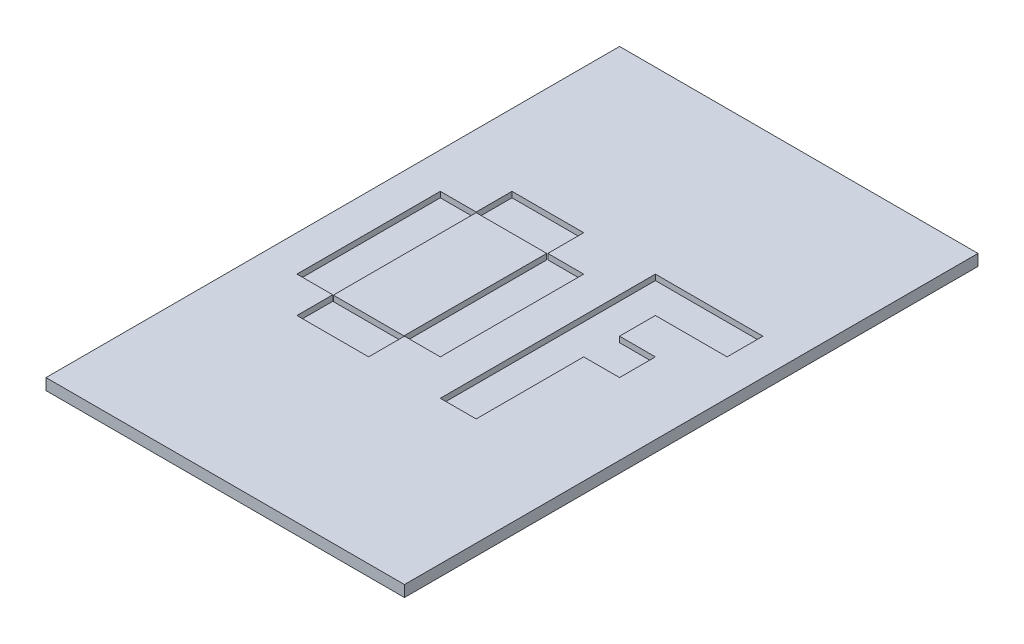
ISO-10303-21;
HEADER;
FILE_DESCRIPTION(('STEP AP214'),'2;1');
FILE_NAME('part.step','',(''),(''),'','','');
FILE_SCHEMA(('AUTOMOTIVE_DESIGN { 1 0 10303 214 1 1 1 1 }'));
ENDSEC;
DATA;
#1=APPLICATION_CONTEXT('core data for automotive mechanical design processes');
#2=APPLICATION_PROTOCOL_DEFINITION('international standard','automotive_design',2000,#1);
#3=PRODUCT_CONTEXT('',#1,'mechanical');
#4=PRODUCT('Part','Part','',(#3));
#5=PRODUCT_RELATED_PRODUCT_CATEGORY('part','',(#4));
#6=PRODUCT_DEFINITION_FORMATION('','',#4);
#7=PRODUCT_DEFINITION_CONTEXT('part definition',#1,'design');
#8=PRODUCT_DEFINITION('design','',#6,#7);
#9=PRODUCT_DEFINITION_SHAPE('','',#8);
#10=(LENGTH_UNIT() NAMED_UNIT(*) SI_UNIT(.MILLI.,.METRE.));
#11=(NAMED_UNIT(*) PLANE_ANGLE_UNIT() SI_UNIT($,.RADIAN.));
#12=(NAMED_UNIT(*) SI_UNIT($,.STERADIAN.) SOLID_ANGLE_UNIT());
#13=UNCERTAINTY_MEASURE_WITH_UNIT(LENGTH_MEASURE(1.E-05),#10,'distance_accuracy_value','');
#14=(GEOMETRIC_REPRESENTATION_CONTEXT(3) GLOBAL_UNCERTAINTY_ASSIGNED_CONTEXT((#13)) GLOBAL_UNIT_ASSIGNED_CONTEXT((#10,
#11,#12)) REPRESENTATION_CONTEXT('',''));
#15=CARTESIAN_POINT('',(0.,0.,0.));
#16=DIRECTION('',(0.,0.,1.));
#17=DIRECTION('',(1.,0.,0.));
#18=AXIS2_PLACEMENT_3D('',#15,#16,#17);
#19=CARTESIAN_POINT('',(25.6,4.,-126.8));
#20=DIRECTION('',(1.,0.,0.));
#21=DIRECTION('',(0.,0.,-1.));
#22=AXIS2_PLACEMENT_3D('',#19,#20,#21);
#23=PLANE('',#22);
#24=DIRECTION('',(0.,0.,1.));
#25=VECTOR('',#24,1.);
#26=CARTESIAN_POINT('',(25.6,2.,-126.8));
#27=LINE('',#26,#25);
#28=CARTESIAN_POINT('',(25.6,2.,-126.8));
#29=VERTEX_POINT('',#28);
#30=CARTESIAN_POINT('',(25.6,2.,-76.2));
#31=VERTEX_POINT('',#30);
#32=EDGE_CURVE('E112',#29,#31,#27,.T.);
#33=ORIENTED_EDGE('',*,*,#32,.T.);
#34=DIRECTION('',(0.,-1.,0.));
#35=VECTOR('',#34,1.);
#36=CARTESIAN_POINT('',(25.6,4.,-76.2));
#37=LINE('',#36,#35);
#38=CARTESIAN_POINT('',(25.6,4.,-76.2));
#39=VERTEX_POINT('',#38);
#40=EDGE_CURVE('E12',#39,#31,#37,.T.);
#41=ORIENTED_EDGE('',*,*,#40,.F.);
#42=DIRECTION('',(0.,0.,1.));
#43=VECTOR('',#42,1.);
#44=CARTESIAN_POINT('',(25.6,4.,-126.8));
#45=LINE('',#44,#43);
#46=CARTESIAN_POINT('',(25.6,4.,-126.8));
#47=VERTEX_POINT('',#46);
#48=EDGE_CURVE('E100',#47,#39,#45,.T.);
#49=ORIENTED_EDGE('',*,*,#48,.F.);
#50=DIRECTION('',(0.,-1.,0.));
#51=VECTOR('',#50,1.);
#52=CARTESIAN_POINT('',(25.6,4.,-126.8));
#53=LINE('',#52,#51);
#54=EDGE_CURVE('E108',#47,#29,#53,.T.);
#55=ORIENTED_EDGE('',*,*,#54,.T.);
#56=EDGE_LOOP('',(#33,#41,#49,#55));
#57=FACE_BOUND('',#56,.T.);
#58=ADVANCED_FACE('F49',(#57),#23,.F.);
#59=CARTESIAN_POINT('',(25.6,4.,-76.2));
#60=DIRECTION('',(0.,0.,-1.));
#61=DIRECTION('',(-1.,0.,0.));
#62=AXIS2_PLACEMENT_3D('',#59,#60,#61);
#63=PLANE('',#62);
#64=DIRECTION('',(1.,0.,0.));
#65=VECTOR('',#64,1.);
#66=CARTESIAN_POINT('',(25.6,2.,-76.2));
#67=LINE('',#66,#65);
#68=CARTESIAN_POINT('',(50.6,2.,-76.2));
#69=VERTEX_POINT('',#68);
#70=EDGE_CURVE('E104',#31,#69,#67,.T.);
#71=ORIENTED_EDGE('',*,*,#70,.T.);
#72=DIRECTION('',(0.,-1.,0.));
#73=VECTOR('',#72,1.);
#74=CARTESIAN_POINT('',(50.6,4.,-76.2));
#75=LINE('',#74,#73);
#76=CARTESIAN_POINT('',(50.6,4.,-76.2));
#77=VERTEX_POINT('',#76);
#78=EDGE_CURVE('E57',#77,#69,#75,.T.);
#79=ORIENTED_EDGE('',*,*,#78,.F.);
#80=DIRECTION('',(1.,0.,0.));
#81=VECTOR('',#80,1.);
#82=CARTESIAN_POINT('',(25.6,4.,-76.2));
#83=LINE('',#82,#81);
#84=EDGE_CURVE('E95',#39,#77,#83,.T.);
#85=ORIENTED_EDGE('',*,*,#84,.F.);
#86=ORIENTED_EDGE('',*,*,#40,.T.);
#87=EDGE_LOOP('',(#71,#79,#85,#86));
#88=FACE_BOUND('',#87,.T.);
#89=ADVANCED_FACE('F103',(#88),#63,.F.);
#90=CARTESIAN_POINT('',(50.6,4.,-126.8));
#91=DIRECTION('',(-1.,0.,0.));
#92=DIRECTION('',(0.,0.,1.));
#93=AXIS2_PLACEMENT_3D('',#90,#91,#92);
#94=PLANE('',#93);
#95=DIRECTION('',(0.,0.,-1.));
#96=VECTOR('',#95,1.);
#97=CARTESIAN_POINT('',(50.6,2.,-126.8));
#98=LINE('',#97,#96);
#99=CARTESIAN_POINT('',(50.6,2.,-126.8));
#100=VERTEX_POINT('',#99);
#101=EDGE_CURVE('E82',#69,#100,#98,.T.);
#102=ORIENTED_EDGE('',*,*,#101,.T.);
#103=DIRECTION('',(0.,-1.,0.));
#104=VECTOR('',#103,1.);
#105=CARTESIAN_POINT('',(50.6,4.,-126.8));
#106=LINE('',#105,#104);
#107=CARTESIAN_POINT('',(50.6,4.,-126.8));
#108=VERTEX_POINT('',#107);
#109=EDGE_CURVE('E105',#108,#100,#106,.T.);
#110=ORIENTED_EDGE('',*,*,#109,.F.);
#111=DIRECTION('',(0.,0.,-1.));
#112=VECTOR('',#111,1.);
#113=CARTESIAN_POINT('',(50.6,4.,-126.8));
#114=LINE('',#113,#112);
#115=EDGE_CURVE('E98',#77,#108,#114,.T.);
#116=ORIENTED_EDGE('',*,*,#115,.F.);
#117=ORIENTED_EDGE('',*,*,#78,.T.);
#118=EDGE_LOOP('',(#102,#110,#116,#117));
#119=FACE_BOUND('',#118,.T.);
#120=ADVANCED_FACE('F106',(#119),#94,.F.);
#121=CARTESIAN_POINT('',(25.6,4.,-126.8));
#122=DIRECTION('',(0.,0.,1.));
#123=DIRECTION('',(1.,0.,0.));
#124=AXIS2_PLACEMENT_3D('',#121,#122,#123);
#125=PLANE('',#124);
#126=DIRECTION('',(-1.,0.,0.));
#127=VECTOR('',#126,1.);
#128=CARTESIAN_POINT('',(25.6,2.,-126.8));
#129=LINE('',#128,#127);
#130=EDGE_CURVE('E88',#100,#29,#129,.T.);
#131=ORIENTED_EDGE('',*,*,#130,.T.);
#132=ORIENTED_EDGE('',*,*,#54,.F.);
#133=DIRECTION('',(-1.,0.,0.));
#134=VECTOR('',#133,1.);
#135=CARTESIAN_POINT('',(25.6,4.,-126.8));
#136=LINE('',#135,#134);
#137=EDGE_CURVE('E65',#108,#47,#136,.T.);
#138=ORIENTED_EDGE('',*,*,#137,.F.);
#139=ORIENTED_EDGE('',*,*,#109,.T.);
#140=EDGE_LOOP('',(#131,#132,#138,#139));
#141=FACE_BOUND('',#140,.T.);
#142=ADVANCED_FACE('F119',(#141),#125,.F.);
#143=CARTESIAN_POINT('',(0.,4.,0.));
#144=DIRECTION('',(0.,1.,0.));
#145=DIRECTION('',(0.,0.,1.));
#146=AXIS2_PLACEMENT_3D('',#143,#144,#145);
#147=PLANE('',#146);
#148=ORIENTED_EDGE('',*,*,#48,.T.);
#149=ORIENTED_EDGE('',*,*,#84,.T.);
#150=ORIENTED_EDGE('',*,*,#115,.T.);
#151=ORIENTED_EDGE('',*,*,#137,.T.);
#152=EDGE_LOOP('',(#148,#149,#150,#151));
#153=FACE_BOUND('',#152,.T.);
#154=ADVANCED_FACE('F96',(#153),#147,.T.);
#155=CARTESIAN_POINT('',(0.,2.,0.));
#156=DIRECTION('',(0.,1.,0.));
#157=DIRECTION('',(0.,0.,1.));
#158=AXIS2_PLACEMENT_3D('',#155,#156,#157);
#159=PLANE('',#158);
#160=ORIENTED_EDGE('',*,*,#32,.F.);
#161=ORIENTED_EDGE('',*,*,#130,.F.);
#162=ORIENTED_EDGE('',*,*,#101,.F.);
#163=ORIENTED_EDGE('',*,*,#70,.F.);
#164=EDGE_LOOP('',(#160,#161,#162,#163));
#165=FACE_BOUND('',#164,.T.);
#166=ADVANCED_FACE('F122',(#165),#159,.F.);
#167=CLOSED_SHELL('',(#58,#89,#120,#142,#154,#166));
#168=MANIFOLD_SOLID_BREP('B2',#167);
#169=CARTESIAN_POINT('',(0.,4.,0.));
#170=DIRECTION('',(-1.,0.,0.));
#171=DIRECTION('',(0.,0.,1.));
#172=AXIS2_PLACEMENT_3D('',#169,#170,#171);
#173=PLANE('',#172);
#174=DIRECTION('',(0.,0.,-1.));
#175=VECTOR('',#174,1.);
#176=CARTESIAN_POINT('',(0.,0.,0.));
#177=LINE('',#176,#175);
#178=CARTESIAN_POINT('',(0.,0.,0.));
#179=VERTEX_POINT('',#178);
#180=CARTESIAN_POINT('',(0.,0.,-203.2));
#181=VERTEX_POINT('',#180);
#182=EDGE_CURVE('E511',#179,#181,#177,.T.);
#183=ORIENTED_EDGE('',*,*,#182,.F.);
#184=DIRECTION('',(0.,-1.,0.));
#185=VECTOR('',#184,1.);
#186=CARTESIAN_POINT('',(0.,4.,0.));
#187=LINE('',#186,#185);
#188=CARTESIAN_POINT('',(0.,4.,0.));
#189=VERTEX_POINT('',#188);
#190=EDGE_CURVE('E47',#189,#179,#187,.T.);
#191=ORIENTED_EDGE('',*,*,#190,.F.);
#192=DIRECTION('',(0.,0.,-1.));
#193=VECTOR('',#192,1.);
#194=CARTESIAN_POINT('',(0.,4.,0.));
#195=LINE('',#194,#193);
#196=CARTESIAN_POINT('',(0.,4.,-203.2));
#197=VERTEX_POINT('',#196);
#198=EDGE_CURVE('E529',#189,#197,#195,.T.);
#199=ORIENTED_EDGE('',*,*,#198,.T.);
#200=DIRECTION('',(0.,-1.,0.));
#201=VECTOR('',#200,1.);
#202=CARTESIAN_POINT('',(0.,4.,-203.2));
#203=LINE('',#202,#201);
#204=EDGE_CURVE('E188',#197,#181,#203,.T.);
#205=ORIENTED_EDGE('',*,*,#204,.T.);
#206=EDGE_LOOP('',(#183,#191,#199,#205));
#207=FACE_BOUND('',#206,.T.);
#208=ADVANCED_FACE('F185',(#207),#173,.T.);
#209=CARTESIAN_POINT('',(0.,4.,0.));
#210=DIRECTION('',(0.,0.,-1.));
#211=DIRECTION('',(-1.,0.,0.));
#212=AXIS2_PLACEMENT_3D('',#209,#210,#211);
#213=PLANE('',#212);
#214=DIRECTION('',(1.,0.,0.));
#215=VECTOR('',#214,1.);
#216=CARTESIAN_POINT('',(0.,0.,0.));
#217=LINE('',#216,#215);
#218=CARTESIAN_POINT('',(127.,0.,0.));
#219=VERTEX_POINT('',#218);
#220=EDGE_CURVE('E533',#179,#219,#217,.T.);
#221=ORIENTED_EDGE('',*,*,#220,.T.);
#222=DIRECTION('',(0.,-1.,0.));
#223=VECTOR('',#222,1.);
#224=CARTESIAN_POINT('',(127.,4.,0.));
#225=LINE('',#224,#223);
#226=CARTESIAN_POINT('',(127.,4.,0.));
#227=VERTEX_POINT('',#226);
#228=EDGE_CURVE('E193',#227,#219,#225,.T.);
#229=ORIENTED_EDGE('',*,*,#228,.F.);
#230=DIRECTION('',(1.,0.,0.));
#231=VECTOR('',#230,1.);
#232=CARTESIAN_POINT('',(0.,4.,0.));
#233=LINE('',#232,#231);
#234=EDGE_CURVE('E538',#189,#227,#233,.T.);
#235=ORIENTED_EDGE('',*,*,#234,.F.);
#236=ORIENTED_EDGE('',*,*,#190,.T.);
#237=EDGE_LOOP('',(#221,#229,#235,#236));
#238=FACE_BOUND('',#237,.T.);
#239=ADVANCED_FACE('F565',(#238),#213,.F.);
#240=CARTESIAN_POINT('',(127.,4.,0.));
#241=DIRECTION('',(-1.,0.,0.));
#242=DIRECTION('',(0.,0.,1.));
#243=AXIS2_PLACEMENT_3D('',#240,#241,#242);
#244=PLANE('',#243);
#245=DIRECTION('',(0.,0.,-1.));
#246=VECTOR('',#245,1.);
#247=CARTESIAN_POINT('',(127.,0.,0.));
#248=LINE('',#247,#246);
#249=CARTESIAN_POINT('',(127.,0.,-203.2));
#250=VERTEX_POINT('',#249);
#251=EDGE_CURVE('E545',#219,#250,#248,.T.);
#252=ORIENTED_EDGE('',*,*,#251,.T.);
#253=DIRECTION('',(0.,-1.,0.));
#254=VECTOR('',#253,1.);
#255=CARTESIAN_POINT('',(127.,4.,-203.2));
#256=LINE('',#255,#254);
#257=CARTESIAN_POINT('',(127.,4.,-203.2));
#258=VERTEX_POINT('',#257);
#259=EDGE_CURVE('E550',#258,#250,#256,.T.);
#260=ORIENTED_EDGE('',*,*,#259,.F.);
#261=DIRECTION('',(0.,0.,-1.));
#262=VECTOR('',#261,1.);
#263=CARTESIAN_POINT('',(127.,4.,0.));
#264=LINE('',#263,#262);
#265=EDGE_CURVE('E536',#227,#258,#264,.T.);
#266=ORIENTED_EDGE('',*,*,#265,.F.);
#267=ORIENTED_EDGE('',*,*,#228,.T.);
#268=EDGE_LOOP('',(#252,#260,#266,#267));
#269=FACE_BOUND('',#268,.T.);
#270=ADVANCED_FACE('F569',(#269),#244,.F.);
#271=CARTESIAN_POINT('',(0.,4.,-203.2));
#272=DIRECTION('',(0.,0.,-1.));
#273=DIRECTION('',(-1.,0.,0.));
#274=AXIS2_PLACEMENT_3D('',#271,#272,#273);
#275=PLANE('',#274);
#276=DIRECTION('',(1.,0.,0.));
#277=VECTOR('',#276,1.);
#278=CARTESIAN_POINT('',(0.,0.,-203.2));
#279=LINE('',#278,#277);
#280=EDGE_CURVE('E542',#181,#250,#279,.T.);
#281=ORIENTED_EDGE('',*,*,#280,.F.);
#282=ORIENTED_EDGE('',*,*,#204,.F.);
#283=DIRECTION('',(1.,0.,0.));
#284=VECTOR('',#283,1.);
#285=CARTESIAN_POINT('',(0.,4.,-203.2));
#286=LINE('',#285,#284);
#287=EDGE_CURVE('E532',#197,#258,#286,.T.);
#288=ORIENTED_EDGE('',*,*,#287,.T.);
#289=ORIENTED_EDGE('',*,*,#259,.T.);
#290=EDGE_LOOP('',(#281,#282,#288,#289));
#291=FACE_BOUND('',#290,.T.);
#292=ADVANCED_FACE('F558',(#291),#275,.T.);
#293=CARTESIAN_POINT('',(0.,4.,0.));
#294=DIRECTION('',(0.,-1.,0.));
#295=DIRECTION('',(0.,0.,-1.));
#296=AXIS2_PLACEMENT_3D('',#293,#294,#295);
#297=PLANE('',#296);
#298=DIRECTION('',(0.,0.,1.));
#299=VECTOR('',#298,1.);
#300=CARTESIAN_POINT('',(25.4,4.,0.));
#301=LINE('',#300,#299);
#302=CARTESIAN_POINT('',(25.4,4.,-76.2));
#303=VERTEX_POINT('',#302);
#304=CARTESIAN_POINT('',(25.4,4.,-63.5));
#305=VERTEX_POINT('',#304);
#306=EDGE_CURVE('E407',#303,#305,#301,.T.);
#307=ORIENTED_EDGE('',*,*,#306,.F.);
#308=DIRECTION('',(1.,0.,0.));
#309=VECTOR('',#308,1.);
#310=CARTESIAN_POINT('',(0.,4.,-76.2));
#311=LINE('',#310,#309);
#312=CARTESIAN_POINT('',(12.7,4.,-76.2));
#313=VERTEX_POINT('',#312);
#314=EDGE_CURVE('E201',#313,#303,#311,.T.);
#315=ORIENTED_EDGE('',*,*,#314,.F.);
#316=DIRECTION('',(0.,0.,1.));
#317=VECTOR('',#316,1.);
#318=CARTESIAN_POINT('',(12.7,4.,0.));
#319=LINE('',#318,#317);
#320=CARTESIAN_POINT('',(12.7,4.,-127.));
#321=VERTEX_POINT('',#320);
#322=EDGE_CURVE('E380',#321,#313,#319,.T.);
#323=ORIENTED_EDGE('',*,*,#322,.F.);
#324=DIRECTION('',(1.,0.,0.));
#325=VECTOR('',#324,1.);
#326=CARTESIAN_POINT('',(0.,4.,-127.));
#327=LINE('',#326,#325);
#328=CARTESIAN_POINT('',(25.4,4.,-127.));
#329=VERTEX_POINT('',#328);
#330=EDGE_CURVE('E383',#321,#329,#327,.T.);
#331=ORIENTED_EDGE('',*,*,#330,.T.);
#332=DIRECTION('',(0.,0.,-1.));
#333=VECTOR('',#332,1.);
#334=CARTESIAN_POINT('',(25.4,4.,0.));
#335=LINE('',#334,#333);
#336=CARTESIAN_POINT('',(25.4,4.,-139.7));
#337=VERTEX_POINT('',#336);
#338=EDGE_CURVE('E430',#329,#337,#335,.T.);
#339=ORIENTED_EDGE('',*,*,#338,.T.);
#340=DIRECTION('',(1.,0.,0.));
#341=VECTOR('',#340,1.);
#342=CARTESIAN_POINT('',(0.,4.,-139.7));
#343=LINE('',#342,#341);
#344=CARTESIAN_POINT('',(50.8,4.,-139.7));
#345=VERTEX_POINT('',#344);
#346=EDGE_CURVE('E427',#337,#345,#343,.T.);
#347=ORIENTED_EDGE('',*,*,#346,.T.);
#348=DIRECTION('',(0.,0.,-1.));
#349=VECTOR('',#348,1.);
#350=CARTESIAN_POINT('',(50.8,4.,0.));
#351=LINE('',#350,#349);
#352=CARTESIAN_POINT('',(50.8,4.,-127.));
#353=VERTEX_POINT('',#352);
#354=EDGE_CURVE('E424',#353,#345,#351,.T.);
#355=ORIENTED_EDGE('',*,*,#354,.F.);
#356=DIRECTION('',(1.,0.,0.));
#357=VECTOR('',#356,1.);
#358=CARTESIAN_POINT('',(0.,4.,-127.));
#359=LINE('',#358,#357);
#360=CARTESIAN_POINT('',(63.5,4.,-127.));
#361=VERTEX_POINT('',#360);
#362=EDGE_CURVE('E421',#353,#361,#359,.T.);
#363=ORIENTED_EDGE('',*,*,#362,.T.);
#364=DIRECTION('',(0.,0.,1.));
#365=VECTOR('',#364,1.);
#366=CARTESIAN_POINT('',(63.5,4.,0.));
#367=LINE('',#366,#365);
#368=CARTESIAN_POINT('',(63.5,4.,-76.2));
#369=VERTEX_POINT('',#368);
#370=EDGE_CURVE('E418',#361,#369,#367,.T.);
#371=ORIENTED_EDGE('',*,*,#370,.T.);
#372=DIRECTION('',(1.,0.,0.));
#373=VECTOR('',#372,1.);
#374=CARTESIAN_POINT('',(0.,4.,-76.2));
#375=LINE('',#374,#373);
#376=CARTESIAN_POINT('',(50.8,4.,-76.2));
#377=VERTEX_POINT('',#376);
#378=EDGE_CURVE('E415',#377,#369,#375,.T.);
#379=ORIENTED_EDGE('',*,*,#378,.F.);
#380=DIRECTION('',(0.,0.,1.));
#381=VECTOR('',#380,1.);
#382=CARTESIAN_POINT('',(50.8,4.,0.));
#383=LINE('',#382,#381);
#384=CARTESIAN_POINT('',(50.8,4.,-63.5));
#385=VERTEX_POINT('',#384);
#386=EDGE_CURVE('E412',#377,#385,#383,.T.);
#387=ORIENTED_EDGE('',*,*,#386,.T.);
#388=DIRECTION('',(1.,0.,0.));
#389=VECTOR('',#388,1.);
#390=CARTESIAN_POINT('',(0.,4.,-63.5));
#391=LINE('',#390,#389);
#392=EDGE_CURVE('E409',#305,#385,#391,.T.);
#393=ORIENTED_EDGE('',*,*,#392,.F.);
#394=EDGE_LOOP('',(#307,#315,#323,#331,#339,#347,#355,#363,#371,#379,#387,#393));
#395=FACE_BOUND('',#394,.T.);
#396=DIRECTION('',(0.,0.,1.));
#397=VECTOR('',#396,1.);
#398=CARTESIAN_POINT('',(101.6,4.,-114.3));
#399=LINE('',#398,#397);
#400=CARTESIAN_POINT('',(101.6,4.,-114.3));
#401=VERTEX_POINT('',#400);
#402=CARTESIAN_POINT('',(101.6,4.,-101.6));
#403=VERTEX_POINT('',#402);
#404=EDGE_CURVE('E483',#401,#403,#399,.T.);
#405=ORIENTED_EDGE('',*,*,#404,.T.);
#406=DIRECTION('',(1.,0.,0.));
#407=VECTOR('',#406,1.);
#408=CARTESIAN_POINT('',(88.9,4.,-101.6));
#409=LINE('',#408,#407);
#410=CARTESIAN_POINT('',(88.9,4.,-101.6));
#411=VERTEX_POINT('',#410);
#412=EDGE_CURVE('E209',#411,#403,#409,.T.);
#413=ORIENTED_EDGE('',*,*,#412,.F.);
#414=DIRECTION('',(0.,0.,1.));
#415=VECTOR('',#414,1.);
#416=CARTESIAN_POINT('',(88.9,4.,-101.6));
#417=LINE('',#416,#415);
#418=CARTESIAN_POINT('',(88.9,4.,-63.5));
#419=VERTEX_POINT('',#418);
#420=EDGE_CURVE('E460',#411,#419,#417,.T.);
#421=ORIENTED_EDGE('',*,*,#420,.T.);
#422=DIRECTION('',(1.,0.,0.));
#423=VECTOR('',#422,1.);
#424=CARTESIAN_POINT('',(76.2,4.,-63.5));
#425=LINE('',#424,#423);
#426=CARTESIAN_POINT('',(76.2,4.,-63.5));
#427=VERTEX_POINT('',#426);
#428=EDGE_CURVE('E504',#427,#419,#425,.T.);
#429=ORIENTED_EDGE('',*,*,#428,.F.);
#430=DIRECTION('',(0.,0.,-1.));
#431=VECTOR('',#430,1.);
#432=CARTESIAN_POINT('',(76.2,4.,-63.5));
#433=LINE('',#432,#431);
#434=CARTESIAN_POINT('',(76.2,4.,-139.7));
#435=VERTEX_POINT('',#434);
#436=EDGE_CURVE('E501',#427,#435,#433,.T.);
#437=ORIENTED_EDGE('',*,*,#436,.T.);
#438=DIRECTION('',(1.,0.,0.));
#439=VECTOR('',#438,1.);
#440=CARTESIAN_POINT('',(76.2,4.,-139.7));
#441=LINE('',#440,#439);
#442=CARTESIAN_POINT('',(114.3,4.,-139.7));
#443=VERTEX_POINT('',#442);
#444=EDGE_CURVE('E498',#435,#443,#441,.T.);
#445=ORIENTED_EDGE('',*,*,#444,.T.);
#446=DIRECTION('',(0.,0.,1.));
#447=VECTOR('',#446,1.);
#448=CARTESIAN_POINT('',(114.3,4.,-139.7));
#449=LINE('',#448,#447);
#450=CARTESIAN_POINT('',(114.3,4.,-127.));
#451=VERTEX_POINT('',#450);
#452=EDGE_CURVE('E495',#443,#451,#449,.T.);
#453=ORIENTED_EDGE('',*,*,#452,.T.);
#454=DIRECTION('',(1.,0.,0.));
#455=VECTOR('',#454,1.);
#456=CARTESIAN_POINT('',(88.9,4.,-127.));
#457=LINE('',#456,#455);
#458=CARTESIAN_POINT('',(88.9,4.,-127.));
#459=VERTEX_POINT('',#458);
#460=EDGE_CURVE('E492',#459,#451,#457,.T.);
#461=ORIENTED_EDGE('',*,*,#460,.F.);
#462=DIRECTION('',(0.,0.,1.));
#463=VECTOR('',#462,1.);
#464=CARTESIAN_POINT('',(88.9,4.,-127.));
#465=LINE('',#464,#463);
#466=CARTESIAN_POINT('',(88.9,4.,-114.3));
#467=VERTEX_POINT('',#466);
#468=EDGE_CURVE('E489',#459,#467,#465,.T.);
#469=ORIENTED_EDGE('',*,*,#468,.T.);
#470=DIRECTION('',(1.,0.,0.));
#471=VECTOR('',#470,1.);
#472=CARTESIAN_POINT('',(88.9,4.,-114.3));
#473=LINE('',#472,#471);
#474=EDGE_CURVE('E486',#467,#401,#473,.T.);
#475=ORIENTED_EDGE('',*,*,#474,.T.);
#476=EDGE_LOOP('',(#405,#413,#421,#429,#437,#445,#453,#461,#469,#475));
#477=FACE_BOUND('',#476,.T.);
#478=ORIENTED_EDGE('',*,*,#198,.F.);
#479=ORIENTED_EDGE('',*,*,#234,.T.);
#480=ORIENTED_EDGE('',*,*,#265,.T.);
#481=ORIENTED_EDGE('',*,*,#287,.F.);
#482=EDGE_LOOP('',(#478,#479,#480,#481));
#483=FACE_BOUND('',#482,.T.);
#484=ADVANCED_FACE('F571',(#395,#477,#483),#297,.F.);
#485=CARTESIAN_POINT('',(0.,0.,0.));
#486=DIRECTION('',(0.,-1.,0.));
#487=DIRECTION('',(0.,0.,-1.));
#488=AXIS2_PLACEMENT_3D('',#485,#486,#487);
#489=PLANE('',#488);
#490=ORIENTED_EDGE('',*,*,#182,.T.);
#491=ORIENTED_EDGE('',*,*,#280,.T.);
#492=ORIENTED_EDGE('',*,*,#251,.F.);
#493=ORIENTED_EDGE('',*,*,#220,.F.);
#494=EDGE_LOOP('',(#490,#491,#492,#493));
#495=FACE_BOUND('',#494,.T.);
#496=ADVANCED_FACE('F562',(#495),#489,.T.);
#497=CARTESIAN_POINT('',(88.9,2.,-101.6));
#498=DIRECTION('',(0.,0.,1.));
#499=DIRECTION('',(1.,0.,0.));
#500=AXIS2_PLACEMENT_3D('',#497,#498,#499);
#501=PLANE('',#500);
#502=ORIENTED_EDGE('',*,*,#412,.T.);
#503=DIRECTION('',(0.,1.,0.));
#504=VECTOR('',#503,1.);
#505=CARTESIAN_POINT('',(101.6,2.,-101.6));
#506=LINE('',#505,#504);
#507=CARTESIAN_POINT('',(101.6,2.,-101.6));
#508=VERTEX_POINT('',#507);
#509=EDGE_CURVE('E481',#508,#403,#506,.T.);
#510=ORIENTED_EDGE('',*,*,#509,.F.);
#511=DIRECTION('',(1.,0.,0.));
#512=VECTOR('',#511,1.);
#513=CARTESIAN_POINT('',(88.9,2.,-101.6));
#514=LINE('',#513,#512);
#515=CARTESIAN_POINT('',(88.9,2.,-101.6));
#516=VERTEX_POINT('',#515);
#517=EDGE_CURVE('E456',#516,#508,#514,.T.);
#518=ORIENTED_EDGE('',*,*,#517,.F.);
#519=DIRECTION('',(0.,1.,0.));
#520=VECTOR('',#519,1.);
#521=CARTESIAN_POINT('',(88.9,2.,-101.6));
#522=LINE('',#521,#520);
#523=EDGE_CURVE('E509',#516,#411,#522,.T.);
#524=ORIENTED_EDGE('',*,*,#523,.T.);
#525=EDGE_LOOP('',(#502,#510,#518,#524));
#526=FACE_BOUND('',#525,.T.);
#527=ADVANCED_FACE('F579',(#526),#501,.F.);
#528=CARTESIAN_POINT('',(88.9,2.,-101.6));
#529=DIRECTION('',(-1.,0.,0.));
#530=DIRECTION('',(0.,0.,1.));
#531=AXIS2_PLACEMENT_3D('',#528,#529,#530);
#532=PLANE('',#531);
#533=ORIENTED_EDGE('',*,*,#420,.F.);
#534=ORIENTED_EDGE('',*,*,#523,.F.);
#535=DIRECTION('',(0.,0.,1.));
#536=VECTOR('',#535,1.);
#537=CARTESIAN_POINT('',(88.9,2.,-101.6));
#538=LINE('',#537,#536);
#539=CARTESIAN_POINT('',(88.9,2.,-63.5));
#540=VERTEX_POINT('',#539);
#541=EDGE_CURVE('E479',#516,#540,#538,.T.);
#542=ORIENTED_EDGE('',*,*,#541,.T.);
#543=DIRECTION('',(0.,1.,0.));
#544=VECTOR('',#543,1.);
#545=CARTESIAN_POINT('',(88.9,2.,-63.5));
#546=LINE('',#545,#544);
#547=EDGE_CURVE('E512',#540,#419,#546,.T.);
#548=ORIENTED_EDGE('',*,*,#547,.T.);
#549=EDGE_LOOP('',(#533,#534,#542,#548));
#550=FACE_BOUND('',#549,.T.);
#551=ADVANCED_FACE('F616',(#550),#532,.T.);
#552=CARTESIAN_POINT('',(76.2,2.,-63.5));
#553=DIRECTION('',(0.,0.,1.));
#554=DIRECTION('',(1.,0.,0.));
#555=AXIS2_PLACEMENT_3D('',#552,#553,#554);
#556=PLANE('',#555);
#557=ORIENTED_EDGE('',*,*,#428,.T.);
#558=ORIENTED_EDGE('',*,*,#547,.F.);
#559=DIRECTION('',(1.,0.,0.));
#560=VECTOR('',#559,1.);
#561=CARTESIAN_POINT('',(76.2,2.,-63.5));
#562=LINE('',#561,#560);
#563=CARTESIAN_POINT('',(76.2,2.,-63.5));
#564=VERTEX_POINT('',#563);
#565=EDGE_CURVE('E476',#564,#540,#562,.T.);
#566=ORIENTED_EDGE('',*,*,#565,.F.);
#567=DIRECTION('',(0.,1.,0.));
#568=VECTOR('',#567,1.);
#569=CARTESIAN_POINT('',(76.2,2.,-63.5));
#570=LINE('',#569,#568);
#571=EDGE_CURVE('E514',#564,#427,#570,.T.);
#572=ORIENTED_EDGE('',*,*,#571,.T.);
#573=EDGE_LOOP('',(#557,#558,#566,#572));
#574=FACE_BOUND('',#573,.T.);
#575=ADVANCED_FACE('F625',(#574),#556,.F.);
#576=CARTESIAN_POINT('',(76.2,2.,-63.5));
#577=DIRECTION('',(1.,0.,0.));
#578=DIRECTION('',(0.,0.,-1.));
#579=AXIS2_PLACEMENT_3D('',#576,#577,#578);
#580=PLANE('',#579);
#581=ORIENTED_EDGE('',*,*,#436,.F.);
#582=ORIENTED_EDGE('',*,*,#571,.F.);
#583=DIRECTION('',(0.,0.,-1.));
#584=VECTOR('',#583,1.);
#585=CARTESIAN_POINT('',(76.2,2.,-63.5));
#586=LINE('',#585,#584);
#587=CARTESIAN_POINT('',(76.2,2.,-139.7));
#588=VERTEX_POINT('',#587);
#589=EDGE_CURVE('E473',#564,#588,#586,.T.);
#590=ORIENTED_EDGE('',*,*,#589,.T.);
#591=DIRECTION('',(0.,1.,0.));
#592=VECTOR('',#591,1.);
#593=CARTESIAN_POINT('',(76.2,2.,-139.7));
#594=LINE('',#593,#592);
#595=EDGE_CURVE('E516',#588,#435,#594,.T.);
#596=ORIENTED_EDGE('',*,*,#595,.T.);
#597=EDGE_LOOP('',(#581,#582,#590,#596));
#598=FACE_BOUND('',#597,.T.);
#599=ADVANCED_FACE('F636',(#598),#580,.T.);
#600=CARTESIAN_POINT('',(76.2,2.,-139.7));
#601=DIRECTION('',(0.,0.,1.));
#602=DIRECTION('',(1.,0.,0.));
#603=AXIS2_PLACEMENT_3D('',#600,#601,#602);
#604=PLANE('',#603);
#605=ORIENTED_EDGE('',*,*,#444,.F.);
#606=ORIENTED_EDGE('',*,*,#595,.F.);
#607=DIRECTION('',(1.,0.,0.));
#608=VECTOR('',#607,1.);
#609=CARTESIAN_POINT('',(88.9,2.,-139.7));
#610=LINE('',#609,#608);
#611=CARTESIAN_POINT('',(114.3,2.,-139.7));
#612=VERTEX_POINT('',#611);
#613=EDGE_CURVE('E471',#588,#612,#610,.T.);
#614=ORIENTED_EDGE('',*,*,#613,.T.);
#615=DIRECTION('',(0.,1.,0.));
#616=VECTOR('',#615,1.);
#617=CARTESIAN_POINT('',(114.3,2.,-139.7));
#618=LINE('',#617,#616);
#619=EDGE_CURVE('E518',#612,#443,#618,.T.);
#620=ORIENTED_EDGE('',*,*,#619,.T.);
#621=EDGE_LOOP('',(#605,#606,#614,#620));
#622=FACE_BOUND('',#621,.T.);
#623=ADVANCED_FACE('F647',(#622),#604,.T.);
#624=CARTESIAN_POINT('',(114.3,2.,-139.7));
#625=DIRECTION('',(-1.,0.,0.));
#626=DIRECTION('',(0.,0.,1.));
#627=AXIS2_PLACEMENT_3D('',#624,#625,#626);
#628=PLANE('',#627);
#629=ORIENTED_EDGE('',*,*,#452,.F.);
#630=ORIENTED_EDGE('',*,*,#619,.F.);
#631=DIRECTION('',(0.,0.,1.));
#632=VECTOR('',#631,1.);
#633=CARTESIAN_POINT('',(114.3,2.,-139.7));
#634=LINE('',#633,#632);
#635=CARTESIAN_POINT('',(114.3,2.,-127.));
#636=VERTEX_POINT('',#635);
#637=EDGE_CURVE('E469',#612,#636,#634,.T.);
#638=ORIENTED_EDGE('',*,*,#637,.T.);
#639=DIRECTION('',(0.,1.,0.));
#640=VECTOR('',#639,1.);
#641=CARTESIAN_POINT('',(114.3,2.,-127.));
#642=LINE('',#641,#640);
#643=EDGE_CURVE('E520',#636,#451,#642,.T.);
#644=ORIENTED_EDGE('',*,*,#643,.T.);
#645=EDGE_LOOP('',(#629,#630,#638,#644));
#646=FACE_BOUND('',#645,.T.);
#647=ADVANCED_FACE('F659',(#646),#628,.T.);
#648=CARTESIAN_POINT('',(88.9,2.,-127.));
#649=DIRECTION('',(0.,0.,1.));
#650=DIRECTION('',(1.,0.,0.));
#651=AXIS2_PLACEMENT_3D('',#648,#649,#650);
#652=PLANE('',#651);
#653=ORIENTED_EDGE('',*,*,#460,.T.);
#654=ORIENTED_EDGE('',*,*,#643,.F.);
#655=DIRECTION('',(1.,0.,0.));
#656=VECTOR('',#655,1.);
#657=CARTESIAN_POINT('',(88.9,2.,-127.));
#658=LINE('',#657,#656);
#659=CARTESIAN_POINT('',(88.9,2.,-127.));
#660=VERTEX_POINT('',#659);
#661=EDGE_CURVE('E466',#660,#636,#658,.T.);
#662=ORIENTED_EDGE('',*,*,#661,.F.);
#663=DIRECTION('',(0.,1.,0.));
#664=VECTOR('',#663,1.);
#665=CARTESIAN_POINT('',(88.9,2.,-127.));
#666=LINE('',#665,#664);
#667=EDGE_CURVE('E522',#660,#459,#666,.T.);
#668=ORIENTED_EDGE('',*,*,#667,.T.);
#669=EDGE_LOOP('',(#653,#654,#662,#668));
#670=FACE_BOUND('',#669,.T.);
#671=ADVANCED_FACE('F669',(#670),#652,.F.);
#672=CARTESIAN_POINT('',(88.9,2.,-127.));
#673=DIRECTION('',(-1.,0.,0.));
#674=DIRECTION('',(0.,0.,1.));
#675=AXIS2_PLACEMENT_3D('',#672,#673,#674);
#676=PLANE('',#675);
#677=ORIENTED_EDGE('',*,*,#468,.F.);
#678=ORIENTED_EDGE('',*,*,#667,.F.);
#679=DIRECTION('',(0.,0.,1.));
#680=VECTOR('',#679,1.);
#681=CARTESIAN_POINT('',(88.9,2.,-127.));
#682=LINE('',#681,#680);
#683=CARTESIAN_POINT('',(88.9,2.,-114.3));
#684=VERTEX_POINT('',#683);
#685=EDGE_CURVE('E464',#660,#684,#682,.T.);
#686=ORIENTED_EDGE('',*,*,#685,.T.);
#687=DIRECTION('',(0.,1.,0.));
#688=VECTOR('',#687,1.);
#689=CARTESIAN_POINT('',(88.9,2.,-114.3));
#690=LINE('',#689,#688);
#691=EDGE_CURVE('E524',#684,#467,#690,.T.);
#692=ORIENTED_EDGE('',*,*,#691,.T.);
#693=EDGE_LOOP('',(#677,#678,#686,#692));
#694=FACE_BOUND('',#693,.T.);
#695=ADVANCED_FACE('F680',(#694),#676,.T.);
#696=CARTESIAN_POINT('',(88.9,2.,-114.3));
#697=DIRECTION('',(0.,0.,1.));
#698=DIRECTION('',(1.,0.,0.));
#699=AXIS2_PLACEMENT_3D('',#696,#697,#698);
#700=PLANE('',#699);
#701=ORIENTED_EDGE('',*,*,#474,.F.);
#702=ORIENTED_EDGE('',*,*,#691,.F.);
#703=DIRECTION('',(1.,0.,0.));
#704=VECTOR('',#703,1.);
#705=CARTESIAN_POINT('',(88.9,2.,-114.3));
#706=LINE('',#705,#704);
#707=CARTESIAN_POINT('',(101.6,2.,-114.3));
#708=VERTEX_POINT('',#707);
#709=EDGE_CURVE('E462',#684,#708,#706,.T.);
#710=ORIENTED_EDGE('',*,*,#709,.T.);
#711=DIRECTION('',(0.,1.,0.));
#712=VECTOR('',#711,1.);
#713=CARTESIAN_POINT('',(101.6,2.,-114.3));
#714=LINE('',#713,#712);
#715=EDGE_CURVE('E526',#708,#401,#714,.T.);
#716=ORIENTED_EDGE('',*,*,#715,.T.);
#717=EDGE_LOOP('',(#701,#702,#710,#716));
#718=FACE_BOUND('',#717,.T.);
#719=ADVANCED_FACE('F691',(#718),#700,.T.);
#720=CARTESIAN_POINT('',(101.6,2.,-114.3));
#721=DIRECTION('',(-1.,0.,0.));
#722=DIRECTION('',(0.,0.,1.));
#723=AXIS2_PLACEMENT_3D('',#720,#721,#722);
#724=PLANE('',#723);
#725=ORIENTED_EDGE('',*,*,#404,.F.);
#726=ORIENTED_EDGE('',*,*,#715,.F.);
#727=DIRECTION('',(0.,0.,1.));
#728=VECTOR('',#727,1.);
#729=CARTESIAN_POINT('',(101.6,2.,-114.3));
#730=LINE('',#729,#728);
#731=EDGE_CURVE('E459',#708,#508,#730,.T.);
#732=ORIENTED_EDGE('',*,*,#731,.T.);
#733=ORIENTED_EDGE('',*,*,#509,.T.);
#734=EDGE_LOOP('',(#725,#726,#732,#733));
#735=FACE_BOUND('',#734,.T.);
#736=ADVANCED_FACE('F702',(#735),#724,.T.);
#737=CARTESIAN_POINT('',(0.,2.,0.));
#738=DIRECTION('',(0.,-1.,0.));
#739=DIRECTION('',(0.,0.,-1.));
#740=AXIS2_PLACEMENT_3D('',#737,#738,#739);
#741=PLANE('',#740);
#742=ORIENTED_EDGE('',*,*,#517,.T.);
#743=ORIENTED_EDGE('',*,*,#731,.F.);
#744=ORIENTED_EDGE('',*,*,#709,.F.);
#745=ORIENTED_EDGE('',*,*,#685,.F.);
#746=ORIENTED_EDGE('',*,*,#661,.T.);
#747=ORIENTED_EDGE('',*,*,#637,.F.);
#748=ORIENTED_EDGE('',*,*,#613,.F.);
#749=ORIENTED_EDGE('',*,*,#589,.F.);
#750=ORIENTED_EDGE('',*,*,#565,.T.);
#751=ORIENTED_EDGE('',*,*,#541,.F.);
#752=EDGE_LOOP('',(#742,#743,#744,#745,#746,#747,#748,#749,#750,#751));
#753=FACE_BOUND('',#752,.T.);
#754=ADVANCED_FACE('F713',(#753),#741,.F.);
#755=CARTESIAN_POINT('',(0.,2.,-76.2));
#756=DIRECTION('',(0.,0.,1.));
#757=DIRECTION('',(1.,0.,0.));
#758=AXIS2_PLACEMENT_3D('',#755,#756,#757);
#759=PLANE('',#758);
#760=ORIENTED_EDGE('',*,*,#314,.T.);
#761=DIRECTION('',(0.,1.,0.));
#762=VECTOR('',#761,1.);
#763=CARTESIAN_POINT('',(25.4,2.,-76.2));
#764=LINE('',#763,#762);
#765=CARTESIAN_POINT('',(25.4,2.,-76.2));
#766=VERTEX_POINT('',#765);
#767=EDGE_CURVE('E357',#766,#303,#764,.T.);
#768=ORIENTED_EDGE('',*,*,#767,.F.);
#769=DIRECTION('',(1.,0.,0.));
#770=VECTOR('',#769,1.);
#771=CARTESIAN_POINT('',(0.,2.,-76.2));
#772=LINE('',#771,#770);
#773=CARTESIAN_POINT('',(12.7,2.,-76.2));
#774=VERTEX_POINT('',#773);
#775=EDGE_CURVE('E361',#774,#766,#772,.T.);
#776=ORIENTED_EDGE('',*,*,#775,.F.);
#777=DIRECTION('',(0.,1.,0.));
#778=VECTOR('',#777,1.);
#779=CARTESIAN_POINT('',(12.7,2.,-76.2));
#780=LINE('',#779,#778);
#781=EDGE_CURVE('E435',#774,#313,#780,.T.);
#782=ORIENTED_EDGE('',*,*,#781,.T.);
#783=EDGE_LOOP('',(#760,#768,#776,#782));
#784=FACE_BOUND('',#783,.T.);
#785=ADVANCED_FACE('F359',(#784),#759,.F.);
#786=CARTESIAN_POINT('',(12.7,2.,0.));
#787=DIRECTION('',(-1.,0.,0.));
#788=DIRECTION('',(0.,0.,1.));
#789=AXIS2_PLACEMENT_3D('',#786,#787,#788);
#790=PLANE('',#789);
#791=ORIENTED_EDGE('',*,*,#322,.T.);
#792=ORIENTED_EDGE('',*,*,#781,.F.);
#793=DIRECTION('',(0.,0.,1.));
#794=VECTOR('',#793,1.);
#795=CARTESIAN_POINT('',(12.7,2.,0.));
#796=LINE('',#795,#794);
#797=CARTESIAN_POINT('',(12.7,2.,-127.));
#798=VERTEX_POINT('',#797);
#799=EDGE_CURVE('E367',#798,#774,#796,.T.);
#800=ORIENTED_EDGE('',*,*,#799,.F.);
#801=DIRECTION('',(0.,1.,0.));
#802=VECTOR('',#801,1.);
#803=CARTESIAN_POINT('',(12.7,2.,-127.));
#804=LINE('',#803,#802);
#805=EDGE_CURVE('E437',#798,#321,#804,.T.);
#806=ORIENTED_EDGE('',*,*,#805,.T.);
#807=EDGE_LOOP('',(#791,#792,#800,#806));
#808=FACE_BOUND('',#807,.T.);
#809=ADVANCED_FACE('F738',(#808),#790,.F.);
#810=CARTESIAN_POINT('',(0.,2.,-127.));
#811=DIRECTION('',(0.,0.,1.));
#812=DIRECTION('',(1.,0.,0.));
#813=AXIS2_PLACEMENT_3D('',#810,#811,#812);
#814=PLANE('',#813);
#815=ORIENTED_EDGE('',*,*,#330,.F.);
#816=ORIENTED_EDGE('',*,*,#805,.F.);
#817=DIRECTION('',(1.,0.,0.));
#818=VECTOR('',#817,1.);
#819=CARTESIAN_POINT('',(0.,2.,-127.));
#820=LINE('',#819,#818);
#821=CARTESIAN_POINT('',(25.4,2.,-127.));
#822=VERTEX_POINT('',#821);
#823=EDGE_CURVE('E403',#798,#822,#820,.T.);
#824=ORIENTED_EDGE('',*,*,#823,.T.);
#825=DIRECTION('',(0.,1.,0.));
#826=VECTOR('',#825,1.);
#827=CARTESIAN_POINT('',(25.4,2.,-127.));
#828=LINE('',#827,#826);
#829=EDGE_CURVE('E439',#822,#329,#828,.T.);
#830=ORIENTED_EDGE('',*,*,#829,.T.);
#831=EDGE_LOOP('',(#815,#816,#824,#830));
#832=FACE_BOUND('',#831,.T.);
#833=ADVANCED_FACE('F748',(#832),#814,.T.);
#834=CARTESIAN_POINT('',(25.4,2.,0.));
#835=DIRECTION('',(1.,0.,0.));
#836=DIRECTION('',(0.,0.,-1.));
#837=AXIS2_PLACEMENT_3D('',#834,#835,#836);
#838=PLANE('',#837);
#839=ORIENTED_EDGE('',*,*,#338,.F.);
#840=ORIENTED_EDGE('',*,*,#829,.F.);
#841=DIRECTION('',(0.,0.,-1.));
#842=VECTOR('',#841,1.);
#843=CARTESIAN_POINT('',(25.4,2.,0.));
#844=LINE('',#843,#842);
#845=CARTESIAN_POINT('',(25.4,2.,-139.7));
#846=VERTEX_POINT('',#845);
#847=EDGE_CURVE('E401',#822,#846,#844,.T.);
#848=ORIENTED_EDGE('',*,*,#847,.T.);
#849=DIRECTION('',(0.,1.,0.));
#850=VECTOR('',#849,1.);
#851=CARTESIAN_POINT('',(25.4,2.,-139.7));
#852=LINE('',#851,#850);
#853=EDGE_CURVE('E441',#846,#337,#852,.T.);
#854=ORIENTED_EDGE('',*,*,#853,.T.);
#855=EDGE_LOOP('',(#839,#840,#848,#854));
#856=FACE_BOUND('',#855,.T.);
#857=ADVANCED_FACE('F759',(#856),#838,.T.);
#858=CARTESIAN_POINT('',(0.,2.,-139.7));
#859=DIRECTION('',(0.,0.,1.));
#860=DIRECTION('',(1.,0.,0.));
#861=AXIS2_PLACEMENT_3D('',#858,#859,#860);
#862=PLANE('',#861);
#863=ORIENTED_EDGE('',*,*,#346,.F.);
#864=ORIENTED_EDGE('',*,*,#853,.F.);
#865=DIRECTION('',(1.,0.,0.));
#866=VECTOR('',#865,1.);
#867=CARTESIAN_POINT('',(0.,2.,-139.7));
#868=LINE('',#867,#866);
#869=CARTESIAN_POINT('',(50.8,2.,-139.7));
#870=VERTEX_POINT('',#869);
#871=EDGE_CURVE('E399',#846,#870,#868,.T.);
#872=ORIENTED_EDGE('',*,*,#871,.T.);
#873=DIRECTION('',(0.,1.,0.));
#874=VECTOR('',#873,1.);
#875=CARTESIAN_POINT('',(50.8,2.,-139.7));
#876=LINE('',#875,#874);
#877=EDGE_CURVE('E443',#870,#345,#876,.T.);
#878=ORIENTED_EDGE('',*,*,#877,.T.);
#879=EDGE_LOOP('',(#863,#864,#872,#878));
#880=FACE_BOUND('',#879,.T.);
#881=ADVANCED_FACE('F770',(#880),#862,.T.);
#882=CARTESIAN_POINT('',(50.8,2.,0.));
#883=DIRECTION('',(1.,0.,0.));
#884=DIRECTION('',(0.,0.,-1.));
#885=AXIS2_PLACEMENT_3D('',#882,#883,#884);
#886=PLANE('',#885);
#887=ORIENTED_EDGE('',*,*,#354,.T.);
#888=ORIENTED_EDGE('',*,*,#877,.F.);
#889=DIRECTION('',(0.,0.,-1.));
#890=VECTOR('',#889,1.);
#891=CARTESIAN_POINT('',(50.8,2.,0.));
#892=LINE('',#891,#890);
#893=CARTESIAN_POINT('',(50.8,2.,-127.));
#894=VERTEX_POINT('',#893);
#895=EDGE_CURVE('E396',#894,#870,#892,.T.);
#896=ORIENTED_EDGE('',*,*,#895,.F.);
#897=DIRECTION('',(0.,1.,0.));
#898=VECTOR('',#897,1.);
#899=CARTESIAN_POINT('',(50.8,2.,-127.));
#900=LINE('',#899,#898);
#901=EDGE_CURVE('E445',#894,#353,#900,.T.);
#902=ORIENTED_EDGE('',*,*,#901,.T.);
#903=EDGE_LOOP('',(#887,#888,#896,#902));
#904=FACE_BOUND('',#903,.T.);
#905=ADVANCED_FACE('F781',(#904),#886,.F.);
#906=CARTESIAN_POINT('',(0.,2.,-127.));
#907=DIRECTION('',(0.,0.,1.));
#908=DIRECTION('',(1.,0.,0.));
#909=AXIS2_PLACEMENT_3D('',#906,#907,#908);
#910=PLANE('',#909);
#911=ORIENTED_EDGE('',*,*,#362,.F.);
#912=ORIENTED_EDGE('',*,*,#901,.F.);
#913=DIRECTION('',(1.,0.,0.));
#914=VECTOR('',#913,1.);
#915=CARTESIAN_POINT('',(0.,2.,-127.));
#916=LINE('',#915,#914);
#917=CARTESIAN_POINT('',(63.5,2.,-127.));
#918=VERTEX_POINT('',#917);
#919=EDGE_CURVE('E394',#894,#918,#916,.T.);
#920=ORIENTED_EDGE('',*,*,#919,.T.);
#921=DIRECTION('',(0.,1.,0.));
#922=VECTOR('',#921,1.);
#923=CARTESIAN_POINT('',(63.5,2.,-127.));
#924=LINE('',#923,#922);
#925=EDGE_CURVE('E447',#918,#361,#924,.T.);
#926=ORIENTED_EDGE('',*,*,#925,.T.);
#927=EDGE_LOOP('',(#911,#912,#920,#926));
#928=FACE_BOUND('',#927,.T.);
#929=ADVANCED_FACE('F792',(#928),#910,.T.);
#930=CARTESIAN_POINT('',(63.5,2.,0.));
#931=DIRECTION('',(-1.,0.,0.));
#932=DIRECTION('',(0.,0.,1.));
#933=AXIS2_PLACEMENT_3D('',#930,#931,#932);
#934=PLANE('',#933);
#935=ORIENTED_EDGE('',*,*,#370,.F.);
#936=ORIENTED_EDGE('',*,*,#925,.F.);
#937=DIRECTION('',(0.,0.,1.));
#938=VECTOR('',#937,1.);
#939=CARTESIAN_POINT('',(63.5,2.,0.));
#940=LINE('',#939,#938);
#941=CARTESIAN_POINT('',(63.5,2.,-76.2));
#942=VERTEX_POINT('',#941);
#943=EDGE_CURVE('E392',#918,#942,#940,.T.);
#944=ORIENTED_EDGE('',*,*,#943,.T.);
#945=DIRECTION('',(0.,1.,0.));
#946=VECTOR('',#945,1.);
#947=CARTESIAN_POINT('',(63.5,2.,-76.2));
#948=LINE('',#947,#946);
#949=EDGE_CURVE('E449',#942,#369,#948,.T.);
#950=ORIENTED_EDGE('',*,*,#949,.T.);
#951=EDGE_LOOP('',(#935,#936,#944,#950));
#952=FACE_BOUND('',#951,.T.);
#953=ADVANCED_FACE('F803',(#952),#934,.T.);
#954=CARTESIAN_POINT('',(0.,2.,-76.2));
#955=DIRECTION('',(0.,0.,1.));
#956=DIRECTION('',(1.,0.,0.));
#957=AXIS2_PLACEMENT_3D('',#954,#955,#956);
#958=PLANE('',#957);
#959=ORIENTED_EDGE('',*,*,#378,.T.);
#960=ORIENTED_EDGE('',*,*,#949,.F.);
#961=DIRECTION('',(1.,0.,0.));
#962=VECTOR('',#961,1.);
#963=CARTESIAN_POINT('',(0.,2.,-76.2));
#964=LINE('',#963,#962);
#965=CARTESIAN_POINT('',(50.8,2.,-76.2));
#966=VERTEX_POINT('',#965);
#967=EDGE_CURVE('E389',#966,#942,#964,.T.);
#968=ORIENTED_EDGE('',*,*,#967,.F.);
#969=DIRECTION('',(0.,1.,0.));
#970=VECTOR('',#969,1.);
#971=CARTESIAN_POINT('',(50.8,2.,-76.2));
#972=LINE('',#971,#970);
#973=EDGE_CURVE('E451',#966,#377,#972,.T.);
#974=ORIENTED_EDGE('',*,*,#973,.T.);
#975=EDGE_LOOP('',(#959,#960,#968,#974));
#976=FACE_BOUND('',#975,.T.);
#977=ADVANCED_FACE('F814',(#976),#958,.F.);
#978=CARTESIAN_POINT('',(50.8,2.,0.));
#979=DIRECTION('',(-1.,0.,0.));
#980=DIRECTION('',(0.,0.,1.));
#981=AXIS2_PLACEMENT_3D('',#978,#979,#980);
#982=PLANE('',#981);
#983=ORIENTED_EDGE('',*,*,#386,.F.);
#984=ORIENTED_EDGE('',*,*,#973,.F.);
#985=DIRECTION('',(0.,0.,1.));
#986=VECTOR('',#985,1.);
#987=CARTESIAN_POINT('',(50.8,2.,0.));
#988=LINE('',#987,#986);
#989=CARTESIAN_POINT('',(50.8,2.,-63.5));
#990=VERTEX_POINT('',#989);
#991=EDGE_CURVE('E387',#966,#990,#988,.T.);
#992=ORIENTED_EDGE('',*,*,#991,.T.);
#993=DIRECTION('',(0.,1.,0.));
#994=VECTOR('',#993,1.);
#995=CARTESIAN_POINT('',(50.8,2.,-63.5));
#996=LINE('',#995,#994);
#997=EDGE_CURVE('E453',#990,#385,#996,.T.);
#998=ORIENTED_EDGE('',*,*,#997,.T.);
#999=EDGE_LOOP('',(#983,#984,#992,#998));
#1000=FACE_BOUND('',#999,.T.);
#1001=ADVANCED_FACE('F825',(#1000),#982,.T.);
#1002=CARTESIAN_POINT('',(0.,2.,-63.5));
#1003=DIRECTION('',(0.,0.,1.));
#1004=DIRECTION('',(1.,0.,0.));
#1005=AXIS2_PLACEMENT_3D('',#1002,#1003,#1004);
#1006=PLANE('',#1005);
#1007=ORIENTED_EDGE('',*,*,#392,.T.);
#1008=ORIENTED_EDGE('',*,*,#997,.F.);
#1009=DIRECTION('',(1.,0.,0.));
#1010=VECTOR('',#1009,1.);
#1011=CARTESIAN_POINT('',(0.,2.,-63.5));
#1012=LINE('',#1011,#1010);
#1013=CARTESIAN_POINT('',(25.4,2.,-63.5));
#1014=VERTEX_POINT('',#1013);
#1015=EDGE_CURVE('E375',#1014,#990,#1012,.T.);
#1016=ORIENTED_EDGE('',*,*,#1015,.F.);
#1017=DIRECTION('',(0.,1.,0.));
#1018=VECTOR('',#1017,1.);
#1019=CARTESIAN_POINT('',(25.4,2.,-63.5));
#1020=LINE('',#1019,#1018);
#1021=EDGE_CURVE('E366',#1014,#305,#1020,.T.);
#1022=ORIENTED_EDGE('',*,*,#1021,.T.);
#1023=EDGE_LOOP('',(#1007,#1008,#1016,#1022));
#1024=FACE_BOUND('',#1023,.T.);
#1025=ADVANCED_FACE('F836',(#1024),#1006,.F.);
#1026=CARTESIAN_POINT('',(25.4,2.,0.));
#1027=DIRECTION('',(-1.,0.,0.));
#1028=DIRECTION('',(0.,0.,1.));
#1029=AXIS2_PLACEMENT_3D('',#1026,#1027,#1028);
#1030=PLANE('',#1029);
#1031=ORIENTED_EDGE('',*,*,#306,.T.);
#1032=ORIENTED_EDGE('',*,*,#1021,.F.);
#1033=DIRECTION('',(0.,0.,1.));
#1034=VECTOR('',#1033,1.);
#1035=CARTESIAN_POINT('',(25.4,2.,0.));
#1036=LINE('',#1035,#1034);
#1037=EDGE_CURVE('E370',#766,#1014,#1036,.T.);
#1038=ORIENTED_EDGE('',*,*,#1037,.F.);
#1039=ORIENTED_EDGE('',*,*,#767,.T.);
#1040=EDGE_LOOP('',(#1031,#1032,#1038,#1039));
#1041=FACE_BOUND('',#1040,.T.);
#1042=ADVANCED_FACE('F371',(#1041),#1030,.F.);
#1043=CARTESIAN_POINT('',(0.,2.,0.));
#1044=DIRECTION('',(0.,1.,0.));
#1045=DIRECTION('',(0.,0.,1.));
#1046=AXIS2_PLACEMENT_3D('',#1043,#1044,#1045);
#1047=PLANE('',#1046);
#1048=ORIENTED_EDGE('',*,*,#775,.T.);
#1049=ORIENTED_EDGE('',*,*,#1037,.T.);
#1050=ORIENTED_EDGE('',*,*,#1015,.T.);
#1051=ORIENTED_EDGE('',*,*,#991,.F.);
#1052=ORIENTED_EDGE('',*,*,#967,.T.);
#1053=ORIENTED_EDGE('',*,*,#943,.F.);
#1054=ORIENTED_EDGE('',*,*,#919,.F.);
#1055=ORIENTED_EDGE('',*,*,#895,.T.);
#1056=ORIENTED_EDGE('',*,*,#871,.F.);
#1057=ORIENTED_EDGE('',*,*,#847,.F.);
#1058=ORIENTED_EDGE('',*,*,#823,.F.);
#1059=ORIENTED_EDGE('',*,*,#799,.T.);
#1060=EDGE_LOOP('',(#1048,#1049,#1050,#1051,#1052,#1053,#1054,#1055,#1056,#1057,#1058,#1059));
#1061=FACE_BOUND('',#1060,.T.);
#1062=ADVANCED_FACE('F377',(#1061),#1047,.T.);
#1063=CLOSED_SHELL('',(#208,#239,#270,#292,#484,#496,#527,#551,#575,#599,#623,#647,#671,#695,
#719,#736,#754,#785,#809,#833,#857,#881,#905,#929,#953,#977,#1001,#1025,#1042,#1062));
#1064=MANIFOLD_SOLID_BREP('B6',#1063);
#1065=ADVANCED_BREP_SHAPE_REPRESENTATION('',(#18,#168,#1064),#14);
#1066=SHAPE_DEFINITION_REPRESENTATION(#9,#1065);
ENDSEC;
END-ISO-10303-21;
